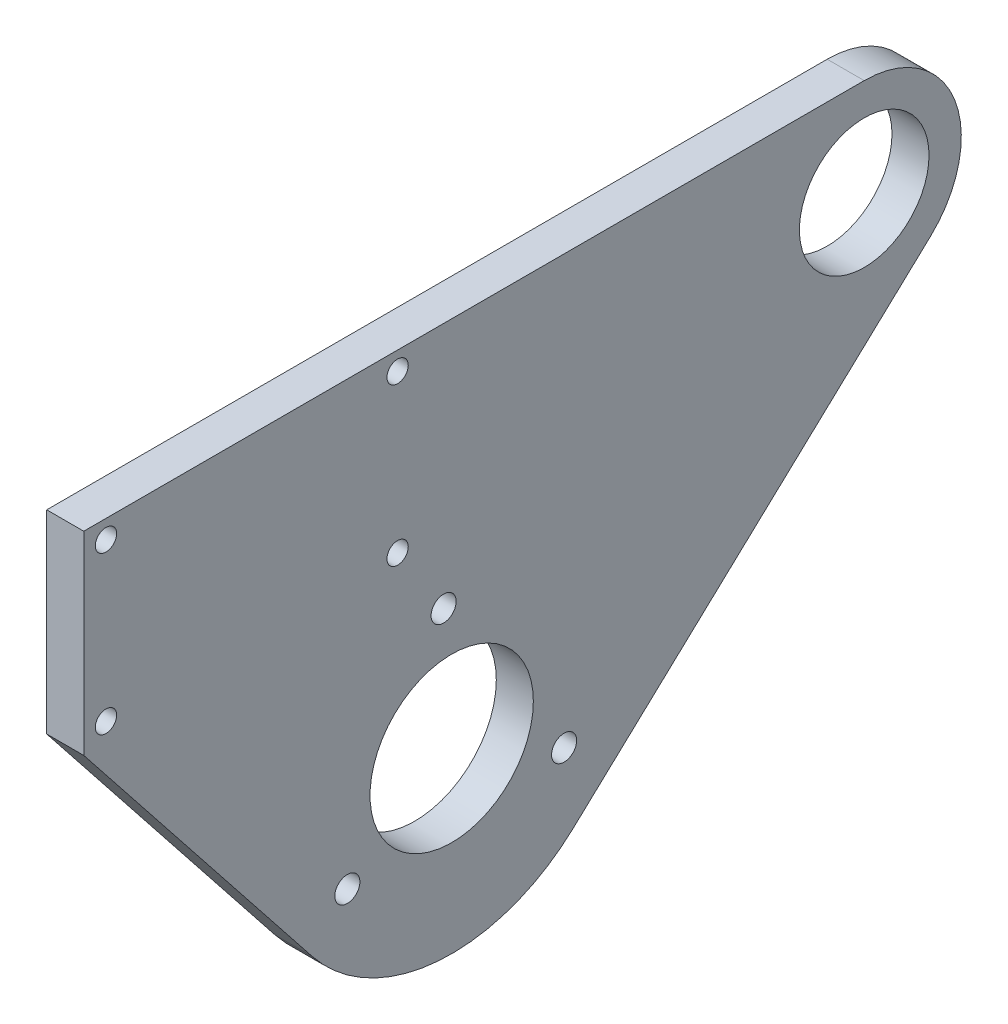
ISO-10303-21;
HEADER;
FILE_DESCRIPTION(('STEP AP214'),'2;1');
FILE_NAME('part.step','',(''),(''),'','','');
FILE_SCHEMA(('AUTOMOTIVE_DESIGN { 1 0 10303 214 1 1 1 1 }'));
ENDSEC;
DATA;
#1=APPLICATION_CONTEXT('core data for automotive mechanical design processes');
#2=APPLICATION_PROTOCOL_DEFINITION('international standard','automotive_design',2000,#1);
#3=PRODUCT_CONTEXT('',#1,'mechanical');
#4=PRODUCT('Part','Part','',(#3));
#5=PRODUCT_RELATED_PRODUCT_CATEGORY('part','',(#4));
#6=PRODUCT_DEFINITION_FORMATION('','',#4);
#7=PRODUCT_DEFINITION_CONTEXT('part definition',#1,'design');
#8=PRODUCT_DEFINITION('design','',#6,#7);
#9=PRODUCT_DEFINITION_SHAPE('','',#8);
#10=(LENGTH_UNIT() NAMED_UNIT(*) SI_UNIT(.MILLI.,.METRE.));
#11=(NAMED_UNIT(*) PLANE_ANGLE_UNIT() SI_UNIT($,.RADIAN.));
#12=(NAMED_UNIT(*) SI_UNIT($,.STERADIAN.) SOLID_ANGLE_UNIT());
#13=UNCERTAINTY_MEASURE_WITH_UNIT(LENGTH_MEASURE(1.E-05),#10,'distance_accuracy_value','');
#14=(GEOMETRIC_REPRESENTATION_CONTEXT(3) GLOBAL_UNCERTAINTY_ASSIGNED_CONTEXT((#13)) GLOBAL_UNIT_ASSIGNED_CONTEXT((#10,
#11,#12)) REPRESENTATION_CONTEXT('',''));
#15=CARTESIAN_POINT('',(0.,0.,0.));
#16=DIRECTION('',(0.,0.,1.));
#17=DIRECTION('',(1.,0.,0.));
#18=AXIS2_PLACEMENT_3D('',#15,#16,#17);
#19=CARTESIAN_POINT('',(3.175,-47.145,70.7272859298305));
#20=DIRECTION('',(-1.,0.,0.));
#21=DIRECTION('',(0.,0.,1.));
#22=AXIS2_PLACEMENT_3D('',#19,#20,#21);
#23=CYLINDRICAL_SURFACE('',#22,30.5);
#24=CARTESIAN_POINT('',(-3.175,-47.145,70.7272859298305));
#25=DIRECTION('',(1.,0.,0.));
#26=DIRECTION('',(0.,0.,-1.));
#27=AXIS2_PLACEMENT_3D('',#24,#25,#26);
#28=CIRCLE('',#27,30.5);
#29=CARTESIAN_POINT('',(-3.175,-66.0871665562138,94.6321876480274));
#30=VERTEX_POINT('',#29);
#31=CARTESIAN_POINT('',(-3.175,-69.4267746723576,49.900079745364));
#32=VERTEX_POINT('',#31);
#33=EDGE_CURVE('E134',#30,#32,#28,.T.);
#34=ORIENTED_EDGE('',*,*,#33,.T.);
#35=DIRECTION('',(-1.,0.,0.));
#36=VECTOR('',#35,1.);
#37=CARTESIAN_POINT('',(3.175,-69.4267746723576,49.900079745364));
#38=LINE('',#37,#36);
#39=CARTESIAN_POINT('',(3.175,-69.4267746723576,49.900079745364));
#40=VERTEX_POINT('',#39);
#41=EDGE_CURVE('E11',#40,#32,#38,.T.);
#42=ORIENTED_EDGE('',*,*,#41,.F.);
#43=CARTESIAN_POINT('',(3.175,-47.145,70.7272859298305));
#44=DIRECTION('',(1.,0.,0.));
#45=DIRECTION('',(0.,0.,-1.));
#46=AXIS2_PLACEMENT_3D('',#43,#44,#45);
#47=CIRCLE('',#46,30.5);
#48=CARTESIAN_POINT('',(3.175,-66.0871665562138,94.6321876480274));
#49=VERTEX_POINT('',#48);
#50=EDGE_CURVE('E165',#49,#40,#47,.T.);
#51=ORIENTED_EDGE('',*,*,#50,.F.);
#52=DIRECTION('',(-1.,0.,0.));
#53=VECTOR('',#52,1.);
#54=CARTESIAN_POINT('',(3.175,-66.0871665562138,94.6321876480274));
#55=LINE('',#54,#53);
#56=EDGE_CURVE('E130',#49,#30,#55,.T.);
#57=ORIENTED_EDGE('',*,*,#56,.T.);
#58=EDGE_LOOP('',(#34,#42,#51,#57));
#59=FACE_BOUND('',#58,.T.);
#60=ADVANCED_FACE('F39',(#59),#23,.T.);
#61=CARTESIAN_POINT('',(3.175,-12.1600045711932,-11.3661917029654));
#62=DIRECTION('',(0.,0.730549989257627,0.682859219162838));
#63=DIRECTION('',(0.,-0.682859219162838,0.730549989257627));
#64=AXIS2_PLACEMENT_3D('',#61,#62,#63);
#65=PLANE('',#64);
#66=DIRECTION('',(0.,0.682859219162838,-0.730549989257627));
#67=VECTOR('',#66,1.);
#68=CARTESIAN_POINT('',(-3.175,-12.1600045711932,-11.3661917029654));
#69=LINE('',#68,#67);
#70=CARTESIAN_POINT('',(-3.175,-12.1600045711932,-11.3661917029654));
#71=VERTEX_POINT('',#70);
#72=EDGE_CURVE('E139',#32,#71,#69,.T.);
#73=ORIENTED_EDGE('',*,*,#72,.T.);
#74=DIRECTION('',(-1.,0.,0.));
#75=VECTOR('',#74,1.);
#76=CARTESIAN_POINT('',(3.175,-12.1600045711932,-11.3661917029654));
#77=LINE('',#76,#75);
#78=CARTESIAN_POINT('',(3.175,-12.1600045711932,-11.3661917029654));
#79=VERTEX_POINT('',#78);
#80=EDGE_CURVE('E49',#79,#71,#77,.T.);
#81=ORIENTED_EDGE('',*,*,#80,.F.);
#82=DIRECTION('',(0.,0.682859219162838,-0.730549989257627));
#83=VECTOR('',#82,1.);
#84=CARTESIAN_POINT('',(3.175,-12.1600045711932,-11.3661917029654));
#85=LINE('',#84,#83);
#86=EDGE_CURVE('E95',#40,#79,#85,.T.);
#87=ORIENTED_EDGE('',*,*,#86,.F.);
#88=ORIENTED_EDGE('',*,*,#41,.T.);
#89=EDGE_LOOP('',(#73,#81,#87,#88));
#90=FACE_BOUND('',#89,.T.);
#91=ADVANCED_FACE('F178',(#90),#65,.F.);
#92=CARTESIAN_POINT('',(3.175,0.,0.));
#93=DIRECTION('',(-1.,0.,0.));
#94=DIRECTION('',(0.,0.,1.));
#95=AXIS2_PLACEMENT_3D('',#92,#93,#94);
#96=CYLINDRICAL_SURFACE('',#95,16.645);
#97=CARTESIAN_POINT('',(-3.175,0.,0.));
#98=DIRECTION('',(1.,0.,0.));
#99=DIRECTION('',(0.,0.,-1.));
#100=AXIS2_PLACEMENT_3D('',#97,#98,#99);
#101=CIRCLE('',#100,16.645);
#102=CARTESIAN_POINT('',(-3.175,16.645,0.));
#103=VERTEX_POINT('',#102);
#104=EDGE_CURVE('E142',#71,#103,#101,.T.);
#105=ORIENTED_EDGE('',*,*,#104,.T.);
#106=DIRECTION('',(-1.,0.,0.));
#107=VECTOR('',#106,1.);
#108=CARTESIAN_POINT('',(3.175,16.645,0.));
#109=LINE('',#108,#107);
#110=CARTESIAN_POINT('',(3.175,16.645,0.));
#111=VERTEX_POINT('',#110);
#112=EDGE_CURVE('E111',#111,#103,#109,.T.);
#113=ORIENTED_EDGE('',*,*,#112,.F.);
#114=CARTESIAN_POINT('',(3.175,0.,0.));
#115=DIRECTION('',(1.,0.,0.));
#116=DIRECTION('',(0.,0.,-1.));
#117=AXIS2_PLACEMENT_3D('',#114,#115,#116);
#118=CIRCLE('',#117,16.645);
#119=EDGE_CURVE('E120',#79,#111,#118,.T.);
#120=ORIENTED_EDGE('',*,*,#119,.F.);
#121=ORIENTED_EDGE('',*,*,#80,.T.);
#122=EDGE_LOOP('',(#105,#113,#120,#121));
#123=FACE_BOUND('',#122,.T.);
#124=ADVANCED_FACE('F157',(#123),#96,.T.);
#125=CARTESIAN_POINT('',(3.175,16.645,0.));
#126=DIRECTION('',(0.,1.,0.));
#127=DIRECTION('',(0.,0.,1.));
#128=AXIS2_PLACEMENT_3D('',#125,#126,#127);
#129=PLANE('',#128);
#130=DIRECTION('',(0.,0.,-1.));
#131=VECTOR('',#130,1.);
#132=CARTESIAN_POINT('',(-3.175,16.645,0.));
#133=LINE('',#132,#131);
#134=CARTESIAN_POINT('',(-3.175,16.645,133.81));
#135=VERTEX_POINT('',#134);
#136=EDGE_CURVE('E110',#135,#103,#133,.T.);
#137=ORIENTED_EDGE('',*,*,#136,.F.);
#138=DIRECTION('',(-1.,0.,0.));
#139=VECTOR('',#138,1.);
#140=CARTESIAN_POINT('',(3.175,16.645,133.81));
#141=LINE('',#140,#139);
#142=CARTESIAN_POINT('',(3.175,16.645,133.81));
#143=VERTEX_POINT('',#142);
#144=EDGE_CURVE('E104',#143,#135,#141,.T.);
#145=ORIENTED_EDGE('',*,*,#144,.F.);
#146=DIRECTION('',(0.,0.,-1.));
#147=VECTOR('',#146,1.);
#148=CARTESIAN_POINT('',(3.175,16.645,0.));
#149=LINE('',#148,#147);
#150=EDGE_CURVE('E108',#143,#111,#149,.T.);
#151=ORIENTED_EDGE('',*,*,#150,.T.);
#152=ORIENTED_EDGE('',*,*,#112,.T.);
#153=EDGE_LOOP('',(#137,#145,#151,#152));
#154=FACE_BOUND('',#153,.T.);
#155=ADVANCED_FACE('F106',(#154),#129,.T.);
#156=CARTESIAN_POINT('',(3.175,0.,133.81));
#157=DIRECTION('',(0.,0.,-1.));
#158=DIRECTION('',(-1.,0.,0.));
#159=AXIS2_PLACEMENT_3D('',#156,#157,#158);
#160=PLANE('',#159);
#161=DIRECTION('',(0.,-1.,0.));
#162=VECTOR('',#161,1.);
#163=CARTESIAN_POINT('',(-3.175,0.,133.81));
#164=LINE('',#163,#162);
#165=CARTESIAN_POINT('',(-3.175,-16.645,133.81));
#166=VERTEX_POINT('',#165);
#167=EDGE_CURVE('E80',#135,#166,#164,.T.);
#168=ORIENTED_EDGE('',*,*,#167,.T.);
#169=DIRECTION('',(-1.,0.,0.));
#170=VECTOR('',#169,1.);
#171=CARTESIAN_POINT('',(3.175,-16.645,133.81));
#172=LINE('',#171,#170);
#173=CARTESIAN_POINT('',(3.175,-16.645,133.81));
#174=VERTEX_POINT('',#173);
#175=EDGE_CURVE('E112',#174,#166,#172,.T.);
#176=ORIENTED_EDGE('',*,*,#175,.F.);
#177=DIRECTION('',(0.,-1.,0.));
#178=VECTOR('',#177,1.);
#179=CARTESIAN_POINT('',(3.175,0.,133.81));
#180=LINE('',#179,#178);
#181=EDGE_CURVE('E114',#143,#174,#180,.T.);
#182=ORIENTED_EDGE('',*,*,#181,.F.);
#183=ORIENTED_EDGE('',*,*,#144,.T.);
#184=EDGE_LOOP('',(#168,#176,#182,#183));
#185=FACE_BOUND('',#184,.T.);
#186=ADVANCED_FACE('F115',(#185),#160,.F.);
#187=CARTESIAN_POINT('',(3.175,-71.5537875003009,90.3004549497181));
#188=DIRECTION('',(0.,0.621054641187338,-0.78376726944908));
#189=DIRECTION('',(0.,0.78376726944908,0.621054641187338));
#190=AXIS2_PLACEMENT_3D('',#187,#188,#189);
#191=PLANE('',#190);
#192=DIRECTION('',(0.,-0.78376726944908,-0.621054641187338));
#193=VECTOR('',#192,1.);
#194=CARTESIAN_POINT('',(-3.175,-71.5537875003009,90.3004549497181));
#195=LINE('',#194,#193);
#196=EDGE_CURVE('E86',#166,#30,#195,.T.);
#197=ORIENTED_EDGE('',*,*,#196,.T.);
#198=ORIENTED_EDGE('',*,*,#56,.F.);
#199=DIRECTION('',(0.,-0.78376726944908,-0.621054641187338));
#200=VECTOR('',#199,1.);
#201=CARTESIAN_POINT('',(3.175,-71.5537875003009,90.3004549497181));
#202=LINE('',#201,#200);
#203=EDGE_CURVE('E57',#174,#49,#202,.T.);
#204=ORIENTED_EDGE('',*,*,#203,.F.);
#205=ORIENTED_EDGE('',*,*,#175,.T.);
#206=EDGE_LOOP('',(#197,#198,#204,#205));
#207=FACE_BOUND('',#206,.T.);
#208=ADVANCED_FACE('F166',(#207),#191,.F.);
#209=CARTESIAN_POINT('',(3.175,-47.145,70.7272859298305));
#210=DIRECTION('',(-1.,0.,0.));
#211=DIRECTION('',(0.,0.,1.));
#212=AXIS2_PLACEMENT_3D('',#209,#210,#211);
#213=CYLINDRICAL_SURFACE('',#212,14.);
#214=CARTESIAN_POINT('',(3.175,-47.145,70.7272859298305));
#215=DIRECTION('',(1.,0.,0.));
#216=DIRECTION('',(0.,0.,-1.));
#217=AXIS2_PLACEMENT_3D('',#214,#215,#216);
#218=CIRCLE('',#217,14.);
#219=CARTESIAN_POINT('',(3.175,-47.145,56.7272859298305));
#220=VERTEX_POINT('',#219);
#221=EDGE_CURVE('E151',#220,#220,#218,.T.);
#222=ORIENTED_EDGE('',*,*,#221,.T.);
#223=EDGE_LOOP('',(#222));
#224=FACE_BOUND('',#223,.T.);
#225=CARTESIAN_POINT('',(-3.175,-47.145,70.7272859298305));
#226=DIRECTION('',(1.,0.,0.));
#227=DIRECTION('',(0.,0.,-1.));
#228=AXIS2_PLACEMENT_3D('',#225,#226,#227);
#229=CIRCLE('',#228,14.);
#230=CARTESIAN_POINT('',(-3.175,-47.145,56.7272859298305));
#231=VERTEX_POINT('',#230);
#232=EDGE_CURVE('E131',#231,#231,#229,.T.);
#233=ORIENTED_EDGE('',*,*,#232,.F.);
#234=EDGE_LOOP('',(#233));
#235=FACE_BOUND('',#234,.T.);
#236=ADVANCED_FACE('F41',(#224,#235),#213,.F.);
#237=CARTESIAN_POINT('',(3.175,0.,0.));
#238=DIRECTION('',(-1.,0.,0.));
#239=DIRECTION('',(0.,0.,1.));
#240=AXIS2_PLACEMENT_3D('',#237,#238,#239);
#241=CYLINDRICAL_SURFACE('',#240,11.1125);
#242=CARTESIAN_POINT('',(3.175,0.,0.));
#243=DIRECTION('',(1.,0.,0.));
#244=DIRECTION('',(0.,0.,-1.));
#245=AXIS2_PLACEMENT_3D('',#242,#243,#244);
#246=CIRCLE('',#245,11.1125);
#247=CARTESIAN_POINT('',(3.175,0.,-11.1125));
#248=VERTEX_POINT('',#247);
#249=EDGE_CURVE('E127',#248,#248,#246,.T.);
#250=ORIENTED_EDGE('',*,*,#249,.T.);
#251=EDGE_LOOP('',(#250));
#252=FACE_BOUND('',#251,.T.);
#253=CARTESIAN_POINT('',(-3.175,0.,0.));
#254=DIRECTION('',(1.,0.,0.));
#255=DIRECTION('',(0.,0.,-1.));
#256=AXIS2_PLACEMENT_3D('',#253,#254,#255);
#257=CIRCLE('',#256,11.1125);
#258=CARTESIAN_POINT('',(-3.175,0.,-11.1125));
#259=VERTEX_POINT('',#258);
#260=EDGE_CURVE('E148',#259,#259,#257,.T.);
#261=ORIENTED_EDGE('',*,*,#260,.F.);
#262=EDGE_LOOP('',(#261));
#263=FACE_BOUND('',#262,.T.);
#264=ADVANCED_FACE('F173',(#252,#263),#241,.F.);
#265=CARTESIAN_POINT('',(3.175,0.,0.));
#266=DIRECTION('',(1.,0.,0.));
#267=DIRECTION('',(0.,0.,-1.));
#268=AXIS2_PLACEMENT_3D('',#265,#266,#267);
#269=PLANE('',#268);
#270=CARTESIAN_POINT('',(3.175,-59.0699117647059,88.6171288414935));
#271=DIRECTION('',(1.,0.,0.));
#272=DIRECTION('',(0.,0.,-1.));
#273=AXIS2_PLACEMENT_3D('',#270,#271,#272);
#274=CIRCLE('',#273,2.15);
#275=CARTESIAN_POINT('',(3.175,-59.0699117647059,86.4671288414935));
#276=VERTEX_POINT('',#275);
#277=EDGE_CURVE('E315',#276,#276,#274,.T.);
#278=ORIENTED_EDGE('',*,*,#277,.F.);
#279=EDGE_LOOP('',(#278));
#280=FACE_BOUND('',#279,.T.);
#281=CARTESIAN_POINT('',(3.175,-56.6756025488602,51.4550879478758));
#282=DIRECTION('',(1.,0.,0.));
#283=DIRECTION('',(0.,0.,-1.));
#284=AXIS2_PLACEMENT_3D('',#281,#282,#283);
#285=CIRCLE('',#284,2.15);
#286=CARTESIAN_POINT('',(3.175,-56.6756025488602,49.3050879478758));
#287=VERTEX_POINT('',#286);
#288=EDGE_CURVE('E317',#287,#287,#285,.T.);
#289=ORIENTED_EDGE('',*,*,#288,.F.);
#290=EDGE_LOOP('',(#289));
#291=FACE_BOUND('',#290,.T.);
#292=CARTESIAN_POINT('',(3.175,-25.6894856864339,72.1096410001223));
#293=DIRECTION('',(1.,0.,0.));
#294=DIRECTION('',(0.,0.,-1.));
#295=AXIS2_PLACEMENT_3D('',#292,#293,#294);
#296=CIRCLE('',#295,2.15);
#297=CARTESIAN_POINT('',(3.175,-25.6894856864339,69.9596410001223));
#298=VERTEX_POINT('',#297);
#299=EDGE_CURVE('E327',#298,#298,#296,.T.);
#300=ORIENTED_EDGE('',*,*,#299,.F.);
#301=EDGE_LOOP('',(#300));
#302=FACE_BOUND('',#301,.T.);
#303=CARTESIAN_POINT('',(3.175,-13.475,80.));
#304=DIRECTION('',(1.,0.,0.));
#305=DIRECTION('',(0.,0.,-1.));
#306=AXIS2_PLACEMENT_3D('',#303,#304,#305);
#307=CIRCLE('',#306,1.8288);
#308=CARTESIAN_POINT('',(3.175,-13.475,78.1712));
#309=VERTEX_POINT('',#308);
#310=EDGE_CURVE('E333',#309,#309,#307,.T.);
#311=ORIENTED_EDGE('',*,*,#310,.F.);
#312=EDGE_LOOP('',(#311));
#313=FACE_BOUND('',#312,.T.);
#314=CARTESIAN_POINT('',(3.175,13.475,80.));
#315=DIRECTION('',(1.,0.,0.));
#316=DIRECTION('',(0.,0.,-1.));
#317=AXIS2_PLACEMENT_3D('',#314,#315,#316);
#318=CIRCLE('',#317,1.8288);
#319=CARTESIAN_POINT('',(3.175,13.475,78.1712));
#320=VERTEX_POINT('',#319);
#321=EDGE_CURVE('E339',#320,#320,#318,.T.);
#322=ORIENTED_EDGE('',*,*,#321,.F.);
#323=EDGE_LOOP('',(#322));
#324=FACE_BOUND('',#323,.T.);
#325=CARTESIAN_POINT('',(3.175,13.475,130.));
#326=DIRECTION('',(1.,0.,0.));
#327=DIRECTION('',(0.,0.,-1.));
#328=AXIS2_PLACEMENT_3D('',#325,#326,#327);
#329=CIRCLE('',#328,1.8288);
#330=CARTESIAN_POINT('',(3.175,13.475,128.1712));
#331=VERTEX_POINT('',#330);
#332=EDGE_CURVE('E345',#331,#331,#329,.T.);
#333=ORIENTED_EDGE('',*,*,#332,.F.);
#334=EDGE_LOOP('',(#333));
#335=FACE_BOUND('',#334,.T.);
#336=CARTESIAN_POINT('',(3.175,-13.475,130.));
#337=DIRECTION('',(1.,0.,0.));
#338=DIRECTION('',(0.,0.,-1.));
#339=AXIS2_PLACEMENT_3D('',#336,#337,#338);
#340=CIRCLE('',#339,1.8288);
#341=CARTESIAN_POINT('',(3.175,-13.475,128.1712));
#342=VERTEX_POINT('',#341);
#343=EDGE_CURVE('E351',#342,#342,#340,.T.);
#344=ORIENTED_EDGE('',*,*,#343,.F.);
#345=EDGE_LOOP('',(#344));
#346=FACE_BOUND('',#345,.T.);
#347=ORIENTED_EDGE('',*,*,#221,.F.);
#348=EDGE_LOOP('',(#347));
#349=FACE_BOUND('',#348,.T.);
#350=ORIENTED_EDGE('',*,*,#50,.T.);
#351=ORIENTED_EDGE('',*,*,#86,.T.);
#352=ORIENTED_EDGE('',*,*,#119,.T.);
#353=ORIENTED_EDGE('',*,*,#150,.F.);
#354=ORIENTED_EDGE('',*,*,#181,.T.);
#355=ORIENTED_EDGE('',*,*,#203,.T.);
#356=EDGE_LOOP('',(#350,#351,#352,#353,#354,#355));
#357=FACE_BOUND('',#356,.T.);
#358=ORIENTED_EDGE('',*,*,#249,.F.);
#359=EDGE_LOOP('',(#358));
#360=FACE_BOUND('',#359,.T.);
#361=ADVANCED_FACE('F117',(#280,#291,#302,#313,#324,#335,#346,#349,#357,#360),#269,.T.);
#362=CARTESIAN_POINT('',(-3.175,0.,0.));
#363=DIRECTION('',(1.,0.,0.));
#364=DIRECTION('',(0.,0.,-1.));
#365=AXIS2_PLACEMENT_3D('',#362,#363,#364);
#366=PLANE('',#365);
#367=CARTESIAN_POINT('',(-3.175,-59.0699117647059,88.6171288414935));
#368=DIRECTION('',(1.,0.,0.));
#369=DIRECTION('',(0.,0.,-1.));
#370=AXIS2_PLACEMENT_3D('',#367,#368,#369);
#371=CIRCLE('',#370,2.15);
#372=CARTESIAN_POINT('',(-3.175,-59.0699117647059,86.4671288414935));
#373=VERTEX_POINT('',#372);
#374=EDGE_CURVE('E312',#373,#373,#371,.T.);
#375=ORIENTED_EDGE('',*,*,#374,.T.);
#376=EDGE_LOOP('',(#375));
#377=FACE_BOUND('',#376,.T.);
#378=CARTESIAN_POINT('',(-3.175,-56.6756025488602,51.4550879478758));
#379=DIRECTION('',(1.,0.,0.));
#380=DIRECTION('',(0.,0.,-1.));
#381=AXIS2_PLACEMENT_3D('',#378,#379,#380);
#382=CIRCLE('',#381,2.15);
#383=CARTESIAN_POINT('',(-3.175,-56.6756025488602,49.3050879478758));
#384=VERTEX_POINT('',#383);
#385=EDGE_CURVE('E323',#384,#384,#382,.T.);
#386=ORIENTED_EDGE('',*,*,#385,.T.);
#387=EDGE_LOOP('',(#386));
#388=FACE_BOUND('',#387,.T.);
#389=CARTESIAN_POINT('',(-3.175,-25.6894856864339,72.1096410001223));
#390=DIRECTION('',(1.,0.,0.));
#391=DIRECTION('',(0.,0.,-1.));
#392=AXIS2_PLACEMENT_3D('',#389,#390,#391);
#393=CIRCLE('',#392,2.15);
#394=CARTESIAN_POINT('',(-3.175,-25.6894856864339,69.9596410001223));
#395=VERTEX_POINT('',#394);
#396=EDGE_CURVE('E330',#395,#395,#393,.T.);
#397=ORIENTED_EDGE('',*,*,#396,.T.);
#398=EDGE_LOOP('',(#397));
#399=FACE_BOUND('',#398,.T.);
#400=CARTESIAN_POINT('',(-3.175,-13.475,80.));
#401=DIRECTION('',(1.,0.,0.));
#402=DIRECTION('',(0.,0.,-1.));
#403=AXIS2_PLACEMENT_3D('',#400,#401,#402);
#404=CIRCLE('',#403,1.8288);
#405=CARTESIAN_POINT('',(-3.175,-13.475,78.1712));
#406=VERTEX_POINT('',#405);
#407=EDGE_CURVE('E336',#406,#406,#404,.T.);
#408=ORIENTED_EDGE('',*,*,#407,.T.);
#409=EDGE_LOOP('',(#408));
#410=FACE_BOUND('',#409,.T.);
#411=CARTESIAN_POINT('',(-3.175,13.475,80.));
#412=DIRECTION('',(1.,0.,0.));
#413=DIRECTION('',(0.,0.,-1.));
#414=AXIS2_PLACEMENT_3D('',#411,#412,#413);
#415=CIRCLE('',#414,1.8288);
#416=CARTESIAN_POINT('',(-3.175,13.475,78.1712));
#417=VERTEX_POINT('',#416);
#418=EDGE_CURVE('E342',#417,#417,#415,.T.);
#419=ORIENTED_EDGE('',*,*,#418,.T.);
#420=EDGE_LOOP('',(#419));
#421=FACE_BOUND('',#420,.T.);
#422=CARTESIAN_POINT('',(-3.175,13.475,130.));
#423=DIRECTION('',(1.,0.,0.));
#424=DIRECTION('',(0.,0.,-1.));
#425=AXIS2_PLACEMENT_3D('',#422,#423,#424);
#426=CIRCLE('',#425,1.8288);
#427=CARTESIAN_POINT('',(-3.175,13.475,128.1712));
#428=VERTEX_POINT('',#427);
#429=EDGE_CURVE('E348',#428,#428,#426,.T.);
#430=ORIENTED_EDGE('',*,*,#429,.T.);
#431=EDGE_LOOP('',(#430));
#432=FACE_BOUND('',#431,.T.);
#433=CARTESIAN_POINT('',(-3.175,-13.475,130.));
#434=DIRECTION('',(1.,0.,0.));
#435=DIRECTION('',(0.,0.,-1.));
#436=AXIS2_PLACEMENT_3D('',#433,#434,#435);
#437=CIRCLE('',#436,1.8288);
#438=CARTESIAN_POINT('',(-3.175,-13.475,128.1712));
#439=VERTEX_POINT('',#438);
#440=EDGE_CURVE('E135',#439,#439,#437,.T.);
#441=ORIENTED_EDGE('',*,*,#440,.T.);
#442=EDGE_LOOP('',(#441));
#443=FACE_BOUND('',#442,.T.);
#444=ORIENTED_EDGE('',*,*,#232,.T.);
#445=EDGE_LOOP('',(#444));
#446=FACE_BOUND('',#445,.T.);
#447=ORIENTED_EDGE('',*,*,#33,.F.);
#448=ORIENTED_EDGE('',*,*,#196,.F.);
#449=ORIENTED_EDGE('',*,*,#167,.F.);
#450=ORIENTED_EDGE('',*,*,#136,.T.);
#451=ORIENTED_EDGE('',*,*,#104,.F.);
#452=ORIENTED_EDGE('',*,*,#72,.F.);
#453=EDGE_LOOP('',(#447,#448,#449,#450,#451,#452));
#454=FACE_BOUND('',#453,.T.);
#455=ORIENTED_EDGE('',*,*,#260,.T.);
#456=EDGE_LOOP('',(#455));
#457=FACE_BOUND('',#456,.T.);
#458=ADVANCED_FACE('F160',(#377,#388,#399,#410,#421,#432,#443,#446,#454,#457),#366,.F.);
#459=CARTESIAN_POINT('',(3.175,-13.475,130.));
#460=DIRECTION('',(1.,0.,0.));
#461=DIRECTION('',(0.,0.,-1.));
#462=AXIS2_PLACEMENT_3D('',#459,#460,#461);
#463=CYLINDRICAL_SURFACE('',#462,1.8288);
#464=ORIENTED_EDGE('',*,*,#440,.F.);
#465=EDGE_LOOP('',(#464));
#466=FACE_BOUND('',#465,.T.);
#467=ORIENTED_EDGE('',*,*,#343,.T.);
#468=EDGE_LOOP('',(#467));
#469=FACE_BOUND('',#468,.T.);
#470=ADVANCED_FACE('F220',(#466,#469),#463,.F.);
#471=CARTESIAN_POINT('',(3.175,13.475,130.));
#472=DIRECTION('',(1.,0.,0.));
#473=DIRECTION('',(0.,0.,-1.));
#474=AXIS2_PLACEMENT_3D('',#471,#472,#473);
#475=CYLINDRICAL_SURFACE('',#474,1.8288);
#476=ORIENTED_EDGE('',*,*,#429,.F.);
#477=EDGE_LOOP('',(#476));
#478=FACE_BOUND('',#477,.T.);
#479=ORIENTED_EDGE('',*,*,#332,.T.);
#480=EDGE_LOOP('',(#479));
#481=FACE_BOUND('',#480,.T.);
#482=ADVANCED_FACE('F225',(#478,#481),#475,.F.);
#483=CARTESIAN_POINT('',(3.175,13.475,80.));
#484=DIRECTION('',(1.,0.,0.));
#485=DIRECTION('',(0.,0.,-1.));
#486=AXIS2_PLACEMENT_3D('',#483,#484,#485);
#487=CYLINDRICAL_SURFACE('',#486,1.8288);
#488=ORIENTED_EDGE('',*,*,#418,.F.);
#489=EDGE_LOOP('',(#488));
#490=FACE_BOUND('',#489,.T.);
#491=ORIENTED_EDGE('',*,*,#321,.T.);
#492=EDGE_LOOP('',(#491));
#493=FACE_BOUND('',#492,.T.);
#494=ADVANCED_FACE('F237',(#490,#493),#487,.F.);
#495=CARTESIAN_POINT('',(3.175,-13.475,80.));
#496=DIRECTION('',(1.,0.,0.));
#497=DIRECTION('',(0.,0.,-1.));
#498=AXIS2_PLACEMENT_3D('',#495,#496,#497);
#499=CYLINDRICAL_SURFACE('',#498,1.8288);
#500=ORIENTED_EDGE('',*,*,#407,.F.);
#501=EDGE_LOOP('',(#500));
#502=FACE_BOUND('',#501,.T.);
#503=ORIENTED_EDGE('',*,*,#310,.T.);
#504=EDGE_LOOP('',(#503));
#505=FACE_BOUND('',#504,.T.);
#506=ADVANCED_FACE('F247',(#502,#505),#499,.F.);
#507=CARTESIAN_POINT('',(3.175,-25.6894856864339,72.1096410001223));
#508=DIRECTION('',(1.,0.,0.));
#509=DIRECTION('',(0.,0.,-1.));
#510=AXIS2_PLACEMENT_3D('',#507,#508,#509);
#511=CYLINDRICAL_SURFACE('',#510,2.15);
#512=ORIENTED_EDGE('',*,*,#396,.F.);
#513=EDGE_LOOP('',(#512));
#514=FACE_BOUND('',#513,.T.);
#515=ORIENTED_EDGE('',*,*,#299,.T.);
#516=EDGE_LOOP('',(#515));
#517=FACE_BOUND('',#516,.T.);
#518=ADVANCED_FACE('F257',(#514,#517),#511,.F.);
#519=CARTESIAN_POINT('',(3.175,-56.6756025488602,51.4550879478758));
#520=DIRECTION('',(1.,0.,0.));
#521=DIRECTION('',(0.,0.,-1.));
#522=AXIS2_PLACEMENT_3D('',#519,#520,#521);
#523=CYLINDRICAL_SURFACE('',#522,2.15);
#524=ORIENTED_EDGE('',*,*,#385,.F.);
#525=EDGE_LOOP('',(#524));
#526=FACE_BOUND('',#525,.T.);
#527=ORIENTED_EDGE('',*,*,#288,.T.);
#528=EDGE_LOOP('',(#527));
#529=FACE_BOUND('',#528,.T.);
#530=ADVANCED_FACE('F285',(#526,#529),#523,.F.);
#531=CARTESIAN_POINT('',(3.175,-59.0699117647059,88.6171288414935));
#532=DIRECTION('',(1.,0.,0.));
#533=DIRECTION('',(0.,0.,-1.));
#534=AXIS2_PLACEMENT_3D('',#531,#532,#533);
#535=CYLINDRICAL_SURFACE('',#534,2.15);
#536=ORIENTED_EDGE('',*,*,#374,.F.);
#537=EDGE_LOOP('',(#536));
#538=FACE_BOUND('',#537,.T.);
#539=ORIENTED_EDGE('',*,*,#277,.T.);
#540=EDGE_LOOP('',(#539));
#541=FACE_BOUND('',#540,.T.);
#542=ADVANCED_FACE('F295',(#538,#541),#535,.F.);
#543=CLOSED_SHELL('',(#60,#91,#124,#155,#186,#208,#236,#264,#361,#458,#470,#482,#494,#506,#518,
#530,#542));
#544=MANIFOLD_SOLID_BREP('B2',#543);
#545=ADVANCED_BREP_SHAPE_REPRESENTATION('',(#18,#544),#14);
#546=SHAPE_DEFINITION_REPRESENTATION(#9,#545);
ENDSEC;
END-ISO-10303-21;
